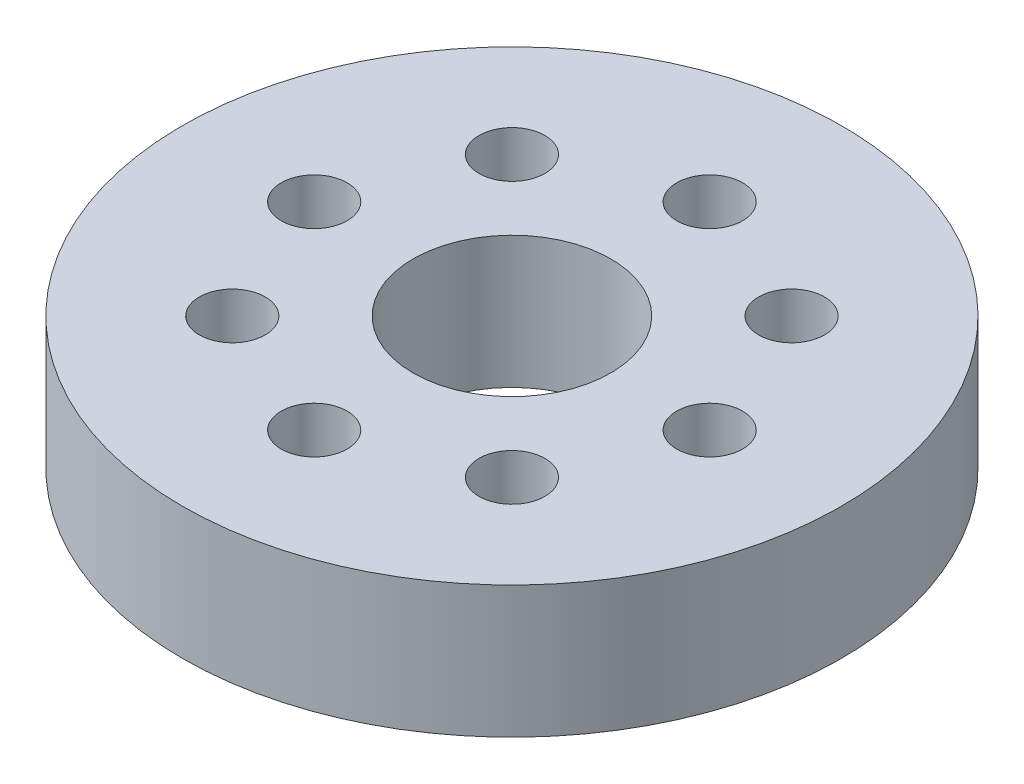
ISO-10303-21;
HEADER;
FILE_DESCRIPTION(('STEP AP214'),'2;1');
FILE_NAME('part.step','',(''),(''),'','','');
FILE_SCHEMA(('AUTOMOTIVE_DESIGN { 1 0 10303 214 1 1 1 1 }'));
ENDSEC;
DATA;
#1=APPLICATION_CONTEXT('core data for automotive mechanical design processes');
#2=APPLICATION_PROTOCOL_DEFINITION('international standard','automotive_design',2000,#1);
#3=PRODUCT_CONTEXT('',#1,'mechanical');
#4=PRODUCT('Part','Part','',(#3));
#5=PRODUCT_RELATED_PRODUCT_CATEGORY('part','',(#4));
#6=PRODUCT_DEFINITION_FORMATION('','',#4);
#7=PRODUCT_DEFINITION_CONTEXT('part definition',#1,'design');
#8=PRODUCT_DEFINITION('design','',#6,#7);
#9=PRODUCT_DEFINITION_SHAPE('','',#8);
#10=(LENGTH_UNIT() NAMED_UNIT(*) SI_UNIT(.MILLI.,.METRE.));
#11=(NAMED_UNIT(*) PLANE_ANGLE_UNIT() SI_UNIT($,.RADIAN.));
#12=(NAMED_UNIT(*) SI_UNIT($,.STERADIAN.) SOLID_ANGLE_UNIT());
#13=UNCERTAINTY_MEASURE_WITH_UNIT(LENGTH_MEASURE(1.E-05),#10,'distance_accuracy_value','');
#14=(GEOMETRIC_REPRESENTATION_CONTEXT(3) GLOBAL_UNCERTAINTY_ASSIGNED_CONTEXT((#13)) GLOBAL_UNIT_ASSIGNED_CONTEXT((#10,
#11,#12)) REPRESENTATION_CONTEXT('',''));
#15=CARTESIAN_POINT('',(0.,0.,0.));
#16=DIRECTION('',(0.,0.,1.));
#17=DIRECTION('',(1.,0.,0.));
#18=AXIS2_PLACEMENT_3D('',#15,#16,#17);
#19=CARTESIAN_POINT('',(0.,4.,0.));
#20=DIRECTION('',(0.,1.,0.));
#21=DIRECTION('',(0.,0.,1.));
#22=AXIS2_PLACEMENT_3D('',#19,#20,#21);
#23=PLANE('',#22);
#24=CARTESIAN_POINT('',(-5.9999999999994,4.,5.96549736338697E-13));
#25=DIRECTION('',(0.,1.,0.));
#26=DIRECTION('',(0.,0.,1.));
#27=AXIS2_PLACEMENT_3D('',#24,#25,#26);
#28=CIRCLE('',#27,1.);
#29=CARTESIAN_POINT('',(-5.9999999999994,4.,1.0000000000006));
#30=VERTEX_POINT('',#29);
#31=EDGE_CURVE('E84',#30,#30,#28,.T.);
#32=ORIENTED_EDGE('',*,*,#31,.F.);
#33=EDGE_LOOP('',(#32));
#34=FACE_BOUND('',#33,.T.);
#35=CARTESIAN_POINT('',(1.19145613012293E-12,4.,6.));
#36=DIRECTION('',(0.,1.,0.));
#37=DIRECTION('',(0.,0.,1.));
#38=AXIS2_PLACEMENT_3D('',#35,#36,#37);
#39=CIRCLE('',#38,1.);
#40=CARTESIAN_POINT('',(1.19145613012293E-12,4.,7.));
#41=VERTEX_POINT('',#40);
#42=EDGE_CURVE('E72',#41,#41,#39,.T.);
#43=ORIENTED_EDGE('',*,*,#42,.F.);
#44=EDGE_LOOP('',(#43));
#45=FACE_BOUND('',#44,.T.);
#46=CARTESIAN_POINT('',(6.0000000000006,4.,-5.95814948259209E-13));
#47=DIRECTION('',(0.,1.,0.));
#48=DIRECTION('',(0.,0.,1.));
#49=AXIS2_PLACEMENT_3D('',#46,#47,#48);
#50=CIRCLE('',#49,1.);
#51=CARTESIAN_POINT('',(6.0000000000006,4.,0.999999999999404));
#52=VERTEX_POINT('',#51);
#53=EDGE_CURVE('E60',#52,#52,#50,.T.);
#54=ORIENTED_EDGE('',*,*,#53,.F.);
#55=EDGE_LOOP('',(#54));
#56=FACE_BOUND('',#55,.T.);
#57=CARTESIAN_POINT('',(0.,4.,-6.));
#58=DIRECTION('',(0.,1.,0.));
#59=DIRECTION('',(0.,0.,1.));
#60=AXIS2_PLACEMENT_3D('',#57,#58,#59);
#61=CIRCLE('',#60,1.);
#62=CARTESIAN_POINT('',(0.,4.,-5.));
#63=VERTEX_POINT('',#62);
#64=EDGE_CURVE('E48',#63,#63,#61,.T.);
#65=ORIENTED_EDGE('',*,*,#64,.F.);
#66=EDGE_LOOP('',(#65));
#67=FACE_BOUND('',#66,.T.);
#68=CARTESIAN_POINT('',(0.,4.,0.));
#69=DIRECTION('',(0.,1.,0.));
#70=DIRECTION('',(0.,0.,1.));
#71=AXIS2_PLACEMENT_3D('',#68,#69,#70);
#72=CIRCLE('',#71,10.);
#73=CARTESIAN_POINT('',(0.,4.,10.));
#74=VERTEX_POINT('',#73);
#75=EDGE_CURVE('E10',#74,#74,#72,.T.);
#76=ORIENTED_EDGE('',*,*,#75,.T.);
#77=EDGE_LOOP('',(#76));
#78=FACE_BOUND('',#77,.T.);
#79=CARTESIAN_POINT('',(0.,4.,0.));
#80=DIRECTION('',(0.,1.,0.));
#81=DIRECTION('',(0.,0.,1.));
#82=AXIS2_PLACEMENT_3D('',#79,#80,#81);
#83=CIRCLE('',#82,3.);
#84=CARTESIAN_POINT('',(0.,4.,3.));
#85=VERTEX_POINT('',#84);
#86=EDGE_CURVE('E43',#85,#85,#83,.T.);
#87=ORIENTED_EDGE('',*,*,#86,.F.);
#88=EDGE_LOOP('',(#87));
#89=FACE_BOUND('',#88,.T.);
#90=CARTESIAN_POINT('',(4.24264068711946,4.,-4.24264068711971));
#91=DIRECTION('',(0.,1.,0.));
#92=DIRECTION('',(0.,0.,1.));
#93=AXIS2_PLACEMENT_3D('',#90,#91,#92);
#94=CIRCLE('',#93,1.);
#95=CARTESIAN_POINT('',(4.24264068711946,4.,-3.24264068711971));
#96=VERTEX_POINT('',#95);
#97=EDGE_CURVE('E54',#96,#96,#94,.T.);
#98=ORIENTED_EDGE('',*,*,#97,.F.);
#99=EDGE_LOOP('',(#98));
#100=FACE_BOUND('',#99,.T.);
#101=CARTESIAN_POINT('',(4.2426406871203,4.,4.24264068711886));
#102=DIRECTION('',(0.,1.,0.));
#103=DIRECTION('',(0.,0.,1.));
#104=AXIS2_PLACEMENT_3D('',#101,#102,#103);
#105=CIRCLE('',#104,1.);
#106=CARTESIAN_POINT('',(4.2426406871203,4.,5.24264068711886));
#107=VERTEX_POINT('',#106);
#108=EDGE_CURVE('E66',#107,#107,#105,.T.);
#109=ORIENTED_EDGE('',*,*,#108,.F.);
#110=EDGE_LOOP('',(#109));
#111=FACE_BOUND('',#110,.T.);
#112=CARTESIAN_POINT('',(-4.24264068711827,4.,4.24264068711971));
#113=DIRECTION('',(0.,1.,0.));
#114=DIRECTION('',(0.,0.,1.));
#115=AXIS2_PLACEMENT_3D('',#112,#113,#114);
#116=CIRCLE('',#115,1.);
#117=CARTESIAN_POINT('',(-4.24264068711827,4.,5.24264068711971));
#118=VERTEX_POINT('',#117);
#119=EDGE_CURVE('E78',#118,#118,#116,.T.);
#120=ORIENTED_EDGE('',*,*,#119,.F.);
#121=EDGE_LOOP('',(#120));
#122=FACE_BOUND('',#121,.T.);
#123=CARTESIAN_POINT('',(-4.24264068711911,4.,-4.24264068711886));
#124=DIRECTION('',(0.,1.,0.));
#125=DIRECTION('',(0.,0.,1.));
#126=AXIS2_PLACEMENT_3D('',#123,#124,#125);
#127=CIRCLE('',#126,1.);
#128=CARTESIAN_POINT('',(-4.24264068711911,4.,-3.24264068711886));
#129=VERTEX_POINT('',#128);
#130=EDGE_CURVE('E90',#129,#129,#127,.T.);
#131=ORIENTED_EDGE('',*,*,#130,.F.);
#132=EDGE_LOOP('',(#131));
#133=FACE_BOUND('',#132,.T.);
#134=ADVANCED_FACE('F32',(#34,#45,#56,#67,#78,#89,#100,#111,#122,#133),#23,.T.);
#135=CARTESIAN_POINT('',(0.,0.,0.));
#136=DIRECTION('',(0.,1.,0.));
#137=DIRECTION('',(0.,0.,1.));
#138=AXIS2_PLACEMENT_3D('',#135,#136,#137);
#139=PLANE('',#138);
#140=CARTESIAN_POINT('',(0.,0.,0.));
#141=DIRECTION('',(0.,1.,0.));
#142=DIRECTION('',(0.,0.,1.));
#143=AXIS2_PLACEMENT_3D('',#140,#141,#142);
#144=CIRCLE('',#143,10.);
#145=CARTESIAN_POINT('',(0.,0.,10.));
#146=VERTEX_POINT('',#145);
#147=EDGE_CURVE('E36',#146,#146,#144,.T.);
#148=ORIENTED_EDGE('',*,*,#147,.F.);
#149=EDGE_LOOP('',(#148));
#150=FACE_BOUND('',#149,.T.);
#151=CARTESIAN_POINT('',(0.,0.,0.));
#152=DIRECTION('',(0.,1.,0.));
#153=DIRECTION('',(0.,0.,1.));
#154=AXIS2_PLACEMENT_3D('',#151,#152,#153);
#155=CIRCLE('',#154,3.);
#156=CARTESIAN_POINT('',(0.,0.,3.));
#157=VERTEX_POINT('',#156);
#158=EDGE_CURVE('E45',#157,#157,#155,.T.);
#159=ORIENTED_EDGE('',*,*,#158,.T.);
#160=EDGE_LOOP('',(#159));
#161=FACE_BOUND('',#160,.T.);
#162=CARTESIAN_POINT('',(0.,0.,-6.));
#163=DIRECTION('',(0.,1.,0.));
#164=DIRECTION('',(0.,0.,1.));
#165=AXIS2_PLACEMENT_3D('',#162,#163,#164);
#166=CIRCLE('',#165,1.);
#167=CARTESIAN_POINT('',(0.,0.,-5.));
#168=VERTEX_POINT('',#167);
#169=EDGE_CURVE('E51',#168,#168,#166,.T.);
#170=ORIENTED_EDGE('',*,*,#169,.T.);
#171=EDGE_LOOP('',(#170));
#172=FACE_BOUND('',#171,.T.);
#173=CARTESIAN_POINT('',(4.24264068711946,0.,-4.24264068711971));
#174=DIRECTION('',(0.,1.,0.));
#175=DIRECTION('',(0.,0.,1.));
#176=AXIS2_PLACEMENT_3D('',#173,#174,#175);
#177=CIRCLE('',#176,1.);
#178=CARTESIAN_POINT('',(4.24264068711946,0.,-3.24264068711971));
#179=VERTEX_POINT('',#178);
#180=EDGE_CURVE('E57',#179,#179,#177,.T.);
#181=ORIENTED_EDGE('',*,*,#180,.T.);
#182=EDGE_LOOP('',(#181));
#183=FACE_BOUND('',#182,.T.);
#184=CARTESIAN_POINT('',(6.0000000000006,0.,-5.95814948259209E-13));
#185=DIRECTION('',(0.,1.,0.));
#186=DIRECTION('',(0.,0.,1.));
#187=AXIS2_PLACEMENT_3D('',#184,#185,#186);
#188=CIRCLE('',#187,1.);
#189=CARTESIAN_POINT('',(6.0000000000006,0.,0.999999999999404));
#190=VERTEX_POINT('',#189);
#191=EDGE_CURVE('E63',#190,#190,#188,.T.);
#192=ORIENTED_EDGE('',*,*,#191,.T.);
#193=EDGE_LOOP('',(#192));
#194=FACE_BOUND('',#193,.T.);
#195=CARTESIAN_POINT('',(4.2426406871203,0.,4.24264068711886));
#196=DIRECTION('',(0.,1.,0.));
#197=DIRECTION('',(0.,0.,1.));
#198=AXIS2_PLACEMENT_3D('',#195,#196,#197);
#199=CIRCLE('',#198,1.);
#200=CARTESIAN_POINT('',(4.2426406871203,0.,5.24264068711886));
#201=VERTEX_POINT('',#200);
#202=EDGE_CURVE('E69',#201,#201,#199,.T.);
#203=ORIENTED_EDGE('',*,*,#202,.T.);
#204=EDGE_LOOP('',(#203));
#205=FACE_BOUND('',#204,.T.);
#206=CARTESIAN_POINT('',(1.19145613012293E-12,0.,6.));
#207=DIRECTION('',(0.,1.,0.));
#208=DIRECTION('',(0.,0.,1.));
#209=AXIS2_PLACEMENT_3D('',#206,#207,#208);
#210=CIRCLE('',#209,1.);
#211=CARTESIAN_POINT('',(1.19145613012293E-12,0.,7.));
#212=VERTEX_POINT('',#211);
#213=EDGE_CURVE('E75',#212,#212,#210,.T.);
#214=ORIENTED_EDGE('',*,*,#213,.T.);
#215=EDGE_LOOP('',(#214));
#216=FACE_BOUND('',#215,.T.);
#217=CARTESIAN_POINT('',(-4.24264068711827,0.,4.24264068711971));
#218=DIRECTION('',(0.,1.,0.));
#219=DIRECTION('',(0.,0.,1.));
#220=AXIS2_PLACEMENT_3D('',#217,#218,#219);
#221=CIRCLE('',#220,1.);
#222=CARTESIAN_POINT('',(-4.24264068711827,0.,5.24264068711971));
#223=VERTEX_POINT('',#222);
#224=EDGE_CURVE('E81',#223,#223,#221,.T.);
#225=ORIENTED_EDGE('',*,*,#224,.T.);
#226=EDGE_LOOP('',(#225));
#227=FACE_BOUND('',#226,.T.);
#228=CARTESIAN_POINT('',(-5.9999999999994,0.,5.96549736338697E-13));
#229=DIRECTION('',(0.,1.,0.));
#230=DIRECTION('',(0.,0.,1.));
#231=AXIS2_PLACEMENT_3D('',#228,#229,#230);
#232=CIRCLE('',#231,1.);
#233=CARTESIAN_POINT('',(-5.9999999999994,0.,1.0000000000006));
#234=VERTEX_POINT('',#233);
#235=EDGE_CURVE('E87',#234,#234,#232,.T.);
#236=ORIENTED_EDGE('',*,*,#235,.T.);
#237=EDGE_LOOP('',(#236));
#238=FACE_BOUND('',#237,.T.);
#239=CARTESIAN_POINT('',(-4.24264068711911,0.,-4.24264068711886));
#240=DIRECTION('',(0.,1.,0.));
#241=DIRECTION('',(0.,0.,1.));
#242=AXIS2_PLACEMENT_3D('',#239,#240,#241);
#243=CIRCLE('',#242,1.);
#244=CARTESIAN_POINT('',(-4.24264068711911,0.,-3.24264068711886));
#245=VERTEX_POINT('',#244);
#246=EDGE_CURVE('E93',#245,#245,#243,.T.);
#247=ORIENTED_EDGE('',*,*,#246,.T.);
#248=EDGE_LOOP('',(#247));
#249=FACE_BOUND('',#248,.T.);
#250=ADVANCED_FACE('F103',(#150,#161,#172,#183,#194,#205,#216,#227,#238,#249),#139,.F.);
#251=CARTESIAN_POINT('',(0.,4.,0.));
#252=DIRECTION('',(0.,-1.,0.));
#253=DIRECTION('',(0.,0.,-1.));
#254=AXIS2_PLACEMENT_3D('',#251,#252,#253);
#255=CYLINDRICAL_SURFACE('',#254,10.);
#256=ORIENTED_EDGE('',*,*,#75,.F.);
#257=EDGE_LOOP('',(#256));
#258=FACE_BOUND('',#257,.T.);
#259=ORIENTED_EDGE('',*,*,#147,.T.);
#260=EDGE_LOOP('',(#259));
#261=FACE_BOUND('',#260,.T.);
#262=ADVANCED_FACE('F34',(#258,#261),#255,.T.);
#263=CARTESIAN_POINT('',(0.,4.,0.));
#264=DIRECTION('',(0.,-1.,0.));
#265=DIRECTION('',(0.,0.,-1.));
#266=AXIS2_PLACEMENT_3D('',#263,#264,#265);
#267=CYLINDRICAL_SURFACE('',#266,3.);
#268=ORIENTED_EDGE('',*,*,#86,.T.);
#269=EDGE_LOOP('',(#268));
#270=FACE_BOUND('',#269,.T.);
#271=ORIENTED_EDGE('',*,*,#158,.F.);
#272=EDGE_LOOP('',(#271));
#273=FACE_BOUND('',#272,.T.);
#274=ADVANCED_FACE('F113',(#270,#273),#267,.F.);
#275=CARTESIAN_POINT('',(0.,4.,-6.));
#276=DIRECTION('',(0.,-1.,0.));
#277=DIRECTION('',(0.,0.,-1.));
#278=AXIS2_PLACEMENT_3D('',#275,#276,#277);
#279=CYLINDRICAL_SURFACE('',#278,1.);
#280=ORIENTED_EDGE('',*,*,#64,.T.);
#281=EDGE_LOOP('',(#280));
#282=FACE_BOUND('',#281,.T.);
#283=ORIENTED_EDGE('',*,*,#169,.F.);
#284=EDGE_LOOP('',(#283));
#285=FACE_BOUND('',#284,.T.);
#286=ADVANCED_FACE('F116',(#282,#285),#279,.F.);
#287=CARTESIAN_POINT('',(4.24264068711946,4.,-4.24264068711971));
#288=DIRECTION('',(0.,-1.,0.));
#289=DIRECTION('',(0.,0.,-1.));
#290=AXIS2_PLACEMENT_3D('',#287,#288,#289);
#291=CYLINDRICAL_SURFACE('',#290,1.);
#292=ORIENTED_EDGE('',*,*,#97,.T.);
#293=EDGE_LOOP('',(#292));
#294=FACE_BOUND('',#293,.T.);
#295=ORIENTED_EDGE('',*,*,#180,.F.);
#296=EDGE_LOOP('',(#295));
#297=FACE_BOUND('',#296,.T.);
#298=ADVANCED_FACE('F120',(#294,#297),#291,.F.);
#299=CARTESIAN_POINT('',(6.0000000000006,4.,-5.95814948259209E-13));
#300=DIRECTION('',(0.,-1.,0.));
#301=DIRECTION('',(0.,0.,-1.));
#302=AXIS2_PLACEMENT_3D('',#299,#300,#301);
#303=CYLINDRICAL_SURFACE('',#302,1.);
#304=ORIENTED_EDGE('',*,*,#53,.T.);
#305=EDGE_LOOP('',(#304));
#306=FACE_BOUND('',#305,.T.);
#307=ORIENTED_EDGE('',*,*,#191,.F.);
#308=EDGE_LOOP('',(#307));
#309=FACE_BOUND('',#308,.T.);
#310=ADVANCED_FACE('F124',(#306,#309),#303,.F.);
#311=CARTESIAN_POINT('',(4.2426406871203,4.,4.24264068711886));
#312=DIRECTION('',(0.,-1.,0.));
#313=DIRECTION('',(0.,0.,-1.));
#314=AXIS2_PLACEMENT_3D('',#311,#312,#313);
#315=CYLINDRICAL_SURFACE('',#314,1.);
#316=ORIENTED_EDGE('',*,*,#108,.T.);
#317=EDGE_LOOP('',(#316));
#318=FACE_BOUND('',#317,.T.);
#319=ORIENTED_EDGE('',*,*,#202,.F.);
#320=EDGE_LOOP('',(#319));
#321=FACE_BOUND('',#320,.T.);
#322=ADVANCED_FACE('F128',(#318,#321),#315,.F.);
#323=CARTESIAN_POINT('',(1.19145613012293E-12,4.,6.));
#324=DIRECTION('',(0.,-1.,0.));
#325=DIRECTION('',(0.,0.,-1.));
#326=AXIS2_PLACEMENT_3D('',#323,#324,#325);
#327=CYLINDRICAL_SURFACE('',#326,1.);
#328=ORIENTED_EDGE('',*,*,#42,.T.);
#329=EDGE_LOOP('',(#328));
#330=FACE_BOUND('',#329,.T.);
#331=ORIENTED_EDGE('',*,*,#213,.F.);
#332=EDGE_LOOP('',(#331));
#333=FACE_BOUND('',#332,.T.);
#334=ADVANCED_FACE('F132',(#330,#333),#327,.F.);
#335=CARTESIAN_POINT('',(-4.24264068711827,4.,4.24264068711971));
#336=DIRECTION('',(0.,-1.,0.));
#337=DIRECTION('',(0.,0.,-1.));
#338=AXIS2_PLACEMENT_3D('',#335,#336,#337);
#339=CYLINDRICAL_SURFACE('',#338,1.);
#340=ORIENTED_EDGE('',*,*,#119,.T.);
#341=EDGE_LOOP('',(#340));
#342=FACE_BOUND('',#341,.T.);
#343=ORIENTED_EDGE('',*,*,#224,.F.);
#344=EDGE_LOOP('',(#343));
#345=FACE_BOUND('',#344,.T.);
#346=ADVANCED_FACE('F136',(#342,#345),#339,.F.);
#347=CARTESIAN_POINT('',(-5.9999999999994,4.,5.96549736338697E-13));
#348=DIRECTION('',(0.,-1.,0.));
#349=DIRECTION('',(0.,0.,-1.));
#350=AXIS2_PLACEMENT_3D('',#347,#348,#349);
#351=CYLINDRICAL_SURFACE('',#350,1.);
#352=ORIENTED_EDGE('',*,*,#31,.T.);
#353=EDGE_LOOP('',(#352));
#354=FACE_BOUND('',#353,.T.);
#355=ORIENTED_EDGE('',*,*,#235,.F.);
#356=EDGE_LOOP('',(#355));
#357=FACE_BOUND('',#356,.T.);
#358=ADVANCED_FACE('F140',(#354,#357),#351,.F.);
#359=CARTESIAN_POINT('',(-4.24264068711911,4.,-4.24264068711886));
#360=DIRECTION('',(0.,-1.,0.));
#361=DIRECTION('',(0.,0.,-1.));
#362=AXIS2_PLACEMENT_3D('',#359,#360,#361);
#363=CYLINDRICAL_SURFACE('',#362,1.);
#364=ORIENTED_EDGE('',*,*,#130,.T.);
#365=EDGE_LOOP('',(#364));
#366=FACE_BOUND('',#365,.T.);
#367=ORIENTED_EDGE('',*,*,#246,.F.);
#368=EDGE_LOOP('',(#367));
#369=FACE_BOUND('',#368,.T.);
#370=ADVANCED_FACE('F99',(#366,#369),#363,.F.);
#371=CLOSED_SHELL('',(#134,#250,#262,#274,#286,#298,#310,#322,#334,#346,#358,#370));
#372=MANIFOLD_SOLID_BREP('B2',#371);
#373=ADVANCED_BREP_SHAPE_REPRESENTATION('',(#18,#372),#14);
#374=SHAPE_DEFINITION_REPRESENTATION(#9,#373);
ENDSEC;
END-ISO-10303-21;
